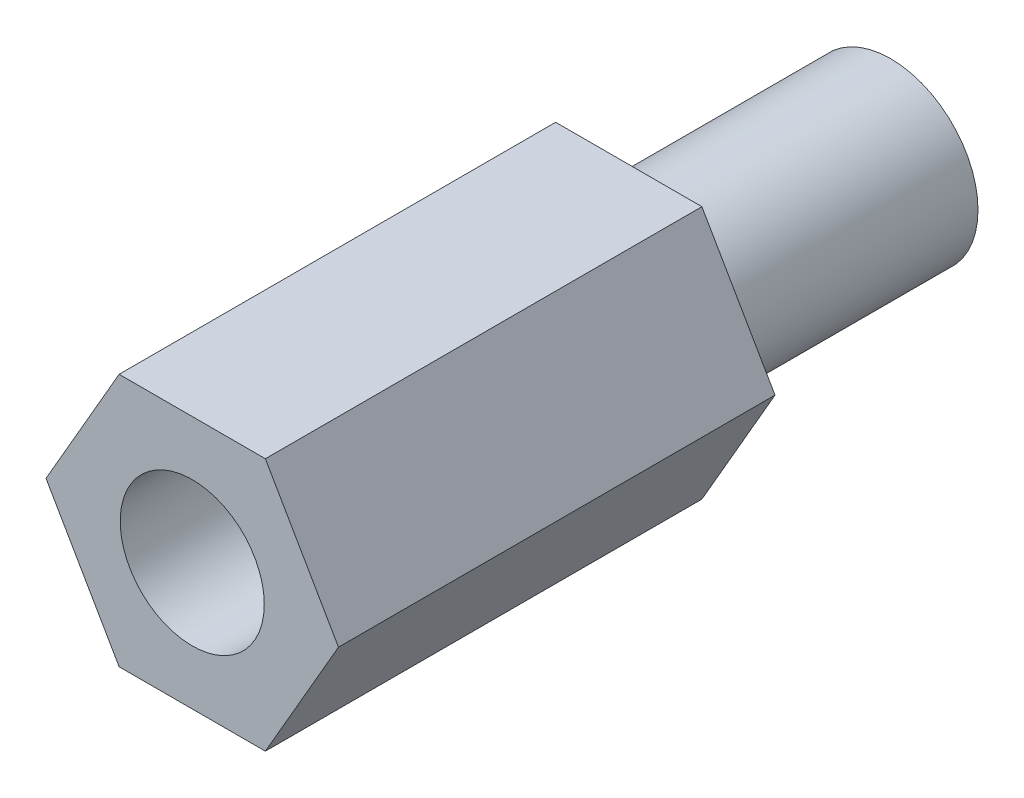
ISO-10303-21;
HEADER;
FILE_DESCRIPTION(('STEP AP214'),'2;1');
FILE_NAME('part.step','',(''),(''),'','','');
FILE_SCHEMA(('AUTOMOTIVE_DESIGN { 1 0 10303 214 1 1 1 1 }'));
ENDSEC;
DATA;
#1=APPLICATION_CONTEXT('core data for automotive mechanical design processes');
#2=APPLICATION_PROTOCOL_DEFINITION('international standard','automotive_design',2000,#1);
#3=PRODUCT_CONTEXT('',#1,'mechanical');
#4=PRODUCT('Part','Part','',(#3));
#5=PRODUCT_RELATED_PRODUCT_CATEGORY('part','',(#4));
#6=PRODUCT_DEFINITION_FORMATION('','',#4);
#7=PRODUCT_DEFINITION_CONTEXT('part definition',#1,'design');
#8=PRODUCT_DEFINITION('design','',#6,#7);
#9=PRODUCT_DEFINITION_SHAPE('','',#8);
#10=(LENGTH_UNIT() NAMED_UNIT(*) SI_UNIT(.MILLI.,.METRE.));
#11=(NAMED_UNIT(*) PLANE_ANGLE_UNIT() SI_UNIT($,.RADIAN.));
#12=(NAMED_UNIT(*) SI_UNIT($,.STERADIAN.) SOLID_ANGLE_UNIT());
#13=UNCERTAINTY_MEASURE_WITH_UNIT(LENGTH_MEASURE(1.E-05),#10,'distance_accuracy_value','');
#14=(GEOMETRIC_REPRESENTATION_CONTEXT(3) GLOBAL_UNCERTAINTY_ASSIGNED_CONTEXT((#13)) GLOBAL_UNIT_ASSIGNED_CONTEXT((#10,
#11,#12)) REPRESENTATION_CONTEXT('',''));
#15=CARTESIAN_POINT('',(0.,0.,0.));
#16=DIRECTION('',(0.,0.,1.));
#17=DIRECTION('',(1.,0.,0.));
#18=AXIS2_PLACEMENT_3D('',#15,#16,#17);
#19=CARTESIAN_POINT('',(3.35,0.,10.));
#20=DIRECTION('',(-0.866025403784438,-0.5,0.));
#21=DIRECTION('',(0.5,-0.866025403784439,0.));
#22=AXIS2_PLACEMENT_3D('',#19,#20,#21);
#23=PLANE('',#22);
#24=DIRECTION('',(-0.5,0.866025403784438,0.));
#25=VECTOR('',#24,1.);
#26=CARTESIAN_POINT('',(3.35,0.,0.));
#27=LINE('',#26,#25);
#28=CARTESIAN_POINT('',(3.35,0.,0.));
#29=VERTEX_POINT('',#28);
#30=CARTESIAN_POINT('',(1.675,2.90118510267787,0.));
#31=VERTEX_POINT('',#30);
#32=EDGE_CURVE('E121',#29,#31,#27,.T.);
#33=ORIENTED_EDGE('',*,*,#32,.T.);
#34=DIRECTION('',(0.,0.,-1.));
#35=VECTOR('',#34,1.);
#36=CARTESIAN_POINT('',(1.675,2.90118510267787,10.));
#37=LINE('',#36,#35);
#38=CARTESIAN_POINT('',(1.675,2.90118510267787,10.));
#39=VERTEX_POINT('',#38);
#40=EDGE_CURVE('E38',#39,#31,#37,.T.);
#41=ORIENTED_EDGE('',*,*,#40,.F.);
#42=DIRECTION('',(-0.5,0.866025403784438,0.));
#43=VECTOR('',#42,1.);
#44=CARTESIAN_POINT('',(3.35,0.,10.));
#45=LINE('',#44,#43);
#46=CARTESIAN_POINT('',(3.35,0.,10.));
#47=VERTEX_POINT('',#46);
#48=EDGE_CURVE('E132',#47,#39,#45,.T.);
#49=ORIENTED_EDGE('',*,*,#48,.F.);
#50=DIRECTION('',(0.,0.,-1.));
#51=VECTOR('',#50,1.);
#52=CARTESIAN_POINT('',(3.35,0.,10.));
#53=LINE('',#52,#51);
#54=EDGE_CURVE('E117',#47,#29,#53,.T.);
#55=ORIENTED_EDGE('',*,*,#54,.T.);
#56=EDGE_LOOP('',(#33,#41,#49,#55));
#57=FACE_BOUND('',#56,.T.);
#58=ADVANCED_FACE('F35',(#57),#23,.F.);
#59=CARTESIAN_POINT('',(1.675,2.90118510267787,10.));
#60=DIRECTION('',(0.,-1.,0.));
#61=DIRECTION('',(1.,0.,0.));
#62=AXIS2_PLACEMENT_3D('',#59,#60,#61);
#63=PLANE('',#62);
#64=DIRECTION('',(-1.,0.,0.));
#65=VECTOR('',#64,1.);
#66=CARTESIAN_POINT('',(1.675,2.90118510267787,0.));
#67=LINE('',#66,#65);
#68=CARTESIAN_POINT('',(-1.675,2.90118510267787,0.));
#69=VERTEX_POINT('',#68);
#70=EDGE_CURVE('E124',#31,#69,#67,.T.);
#71=ORIENTED_EDGE('',*,*,#70,.T.);
#72=DIRECTION('',(0.,0.,-1.));
#73=VECTOR('',#72,1.);
#74=CARTESIAN_POINT('',(-1.675,2.90118510267787,10.));
#75=LINE('',#74,#73);
#76=CARTESIAN_POINT('',(-1.675,2.90118510267787,10.));
#77=VERTEX_POINT('',#76);
#78=EDGE_CURVE('E135',#77,#69,#75,.T.);
#79=ORIENTED_EDGE('',*,*,#78,.F.);
#80=DIRECTION('',(-1.,0.,0.));
#81=VECTOR('',#80,1.);
#82=CARTESIAN_POINT('',(1.675,2.90118510267787,10.));
#83=LINE('',#82,#81);
#84=EDGE_CURVE('E90',#39,#77,#83,.T.);
#85=ORIENTED_EDGE('',*,*,#84,.F.);
#86=ORIENTED_EDGE('',*,*,#40,.T.);
#87=EDGE_LOOP('',(#71,#79,#85,#86));
#88=FACE_BOUND('',#87,.T.);
#89=ADVANCED_FACE('F140',(#88),#63,.F.);
#90=CARTESIAN_POINT('',(-1.675,2.90118510267787,10.));
#91=DIRECTION('',(0.866025403784439,-0.5,0.));
#92=DIRECTION('',(0.5,0.866025403784439,0.));
#93=AXIS2_PLACEMENT_3D('',#90,#91,#92);
#94=PLANE('',#93);
#95=DIRECTION('',(-0.5,-0.866025403784439,0.));
#96=VECTOR('',#95,1.);
#97=CARTESIAN_POINT('',(-1.675,2.90118510267787,0.));
#98=LINE('',#97,#96);
#99=CARTESIAN_POINT('',(-3.35,0.,0.));
#100=VERTEX_POINT('',#99);
#101=EDGE_CURVE('E127',#69,#100,#98,.T.);
#102=ORIENTED_EDGE('',*,*,#101,.T.);
#103=DIRECTION('',(0.,0.,-1.));
#104=VECTOR('',#103,1.);
#105=CARTESIAN_POINT('',(-3.35,0.,10.));
#106=LINE('',#105,#104);
#107=CARTESIAN_POINT('',(-3.35,0.,10.));
#108=VERTEX_POINT('',#107);
#109=EDGE_CURVE('E112',#108,#100,#106,.T.);
#110=ORIENTED_EDGE('',*,*,#109,.F.);
#111=DIRECTION('',(-0.5,-0.866025403784439,0.));
#112=VECTOR('',#111,1.);
#113=CARTESIAN_POINT('',(-1.675,2.90118510267787,10.));
#114=LINE('',#113,#112);
#115=EDGE_CURVE('E103',#77,#108,#114,.T.);
#116=ORIENTED_EDGE('',*,*,#115,.F.);
#117=ORIENTED_EDGE('',*,*,#78,.T.);
#118=EDGE_LOOP('',(#102,#110,#116,#117));
#119=FACE_BOUND('',#118,.T.);
#120=ADVANCED_FACE('F146',(#119),#94,.F.);
#121=CARTESIAN_POINT('',(-3.35,0.,10.));
#122=DIRECTION('',(0.866025403784438,0.5,0.));
#123=DIRECTION('',(-0.5,0.866025403784438,0.));
#124=AXIS2_PLACEMENT_3D('',#121,#122,#123);
#125=PLANE('',#124);
#126=DIRECTION('',(0.5,-0.866025403784438,0.));
#127=VECTOR('',#126,1.);
#128=CARTESIAN_POINT('',(-3.35,0.,0.));
#129=LINE('',#128,#127);
#130=CARTESIAN_POINT('',(-1.675,-2.90118510267787,0.));
#131=VERTEX_POINT('',#130);
#132=EDGE_CURVE('E111',#100,#131,#129,.T.);
#133=ORIENTED_EDGE('',*,*,#132,.T.);
#134=DIRECTION('',(0.,0.,-1.));
#135=VECTOR('',#134,1.);
#136=CARTESIAN_POINT('',(-1.675,-2.90118510267787,10.));
#137=LINE('',#136,#135);
#138=CARTESIAN_POINT('',(-1.675,-2.90118510267787,10.));
#139=VERTEX_POINT('',#138);
#140=EDGE_CURVE('E108',#139,#131,#137,.T.);
#141=ORIENTED_EDGE('',*,*,#140,.F.);
#142=DIRECTION('',(0.5,-0.866025403784438,0.));
#143=VECTOR('',#142,1.);
#144=CARTESIAN_POINT('',(-3.35,0.,10.));
#145=LINE('',#144,#143);
#146=EDGE_CURVE('E97',#108,#139,#145,.T.);
#147=ORIENTED_EDGE('',*,*,#146,.F.);
#148=ORIENTED_EDGE('',*,*,#109,.T.);
#149=EDGE_LOOP('',(#133,#141,#147,#148));
#150=FACE_BOUND('',#149,.T.);
#151=ADVANCED_FACE('F109',(#150),#125,.F.);
#152=CARTESIAN_POINT('',(-1.675,-2.90118510267787,10.));
#153=DIRECTION('',(0.,1.,0.));
#154=DIRECTION('',(-1.,0.,0.));
#155=AXIS2_PLACEMENT_3D('',#152,#153,#154);
#156=PLANE('',#155);
#157=DIRECTION('',(1.,0.,0.));
#158=VECTOR('',#157,1.);
#159=CARTESIAN_POINT('',(-1.675,-2.90118510267787,0.));
#160=LINE('',#159,#158);
#161=CARTESIAN_POINT('',(1.675,-2.90118510267787,0.));
#162=VERTEX_POINT('',#161);
#163=EDGE_CURVE('E75',#131,#162,#160,.T.);
#164=ORIENTED_EDGE('',*,*,#163,.T.);
#165=DIRECTION('',(0.,0.,-1.));
#166=VECTOR('',#165,1.);
#167=CARTESIAN_POINT('',(1.675,-2.90118510267787,10.));
#168=LINE('',#167,#166);
#169=CARTESIAN_POINT('',(1.675,-2.90118510267787,10.));
#170=VERTEX_POINT('',#169);
#171=EDGE_CURVE('E113',#170,#162,#168,.T.);
#172=ORIENTED_EDGE('',*,*,#171,.F.);
#173=DIRECTION('',(1.,0.,0.));
#174=VECTOR('',#173,1.);
#175=CARTESIAN_POINT('',(-1.675,-2.90118510267787,10.));
#176=LINE('',#175,#174);
#177=EDGE_CURVE('E101',#139,#170,#176,.T.);
#178=ORIENTED_EDGE('',*,*,#177,.F.);
#179=ORIENTED_EDGE('',*,*,#140,.T.);
#180=EDGE_LOOP('',(#164,#172,#178,#179));
#181=FACE_BOUND('',#180,.T.);
#182=ADVANCED_FACE('F115',(#181),#156,.F.);
#183=CARTESIAN_POINT('',(1.675,-2.90118510267787,10.));
#184=DIRECTION('',(-0.866025403784439,0.5,0.));
#185=DIRECTION('',(-0.5,-0.866025403784439,0.));
#186=AXIS2_PLACEMENT_3D('',#183,#184,#185);
#187=PLANE('',#186);
#188=DIRECTION('',(0.5,0.866025403784439,0.));
#189=VECTOR('',#188,1.);
#190=CARTESIAN_POINT('',(1.675,-2.90118510267787,0.));
#191=LINE('',#190,#189);
#192=EDGE_CURVE('E81',#162,#29,#191,.T.);
#193=ORIENTED_EDGE('',*,*,#192,.T.);
#194=ORIENTED_EDGE('',*,*,#54,.F.);
#195=DIRECTION('',(0.5,0.866025403784439,0.));
#196=VECTOR('',#195,1.);
#197=CARTESIAN_POINT('',(1.675,-2.90118510267787,10.));
#198=LINE('',#197,#196);
#199=EDGE_CURVE('E52',#170,#47,#198,.T.);
#200=ORIENTED_EDGE('',*,*,#199,.F.);
#201=ORIENTED_EDGE('',*,*,#171,.T.);
#202=EDGE_LOOP('',(#193,#194,#200,#201));
#203=FACE_BOUND('',#202,.T.);
#204=ADVANCED_FACE('F169',(#203),#187,.F.);
#205=CARTESIAN_POINT('',(0.,0.,10.));
#206=DIRECTION('',(0.,0.,1.));
#207=DIRECTION('',(1.,0.,0.));
#208=AXIS2_PLACEMENT_3D('',#205,#206,#207);
#209=PLANE('',#208);
#210=CARTESIAN_POINT('',(0.,0.,10.));
#211=DIRECTION('',(0.,0.,1.));
#212=DIRECTION('',(1.,0.,0.));
#213=AXIS2_PLACEMENT_3D('',#210,#211,#212);
#214=CIRCLE('',#213,1.65);
#215=CARTESIAN_POINT('',(1.65,0.,10.));
#216=VERTEX_POINT('',#215);
#217=EDGE_CURVE('E153',#216,#216,#214,.T.);
#218=ORIENTED_EDGE('',*,*,#217,.F.);
#219=EDGE_LOOP('',(#218));
#220=FACE_BOUND('',#219,.T.);
#221=ORIENTED_EDGE('',*,*,#48,.T.);
#222=ORIENTED_EDGE('',*,*,#84,.T.);
#223=ORIENTED_EDGE('',*,*,#115,.T.);
#224=ORIENTED_EDGE('',*,*,#146,.T.);
#225=ORIENTED_EDGE('',*,*,#177,.T.);
#226=ORIENTED_EDGE('',*,*,#199,.T.);
#227=EDGE_LOOP('',(#221,#222,#223,#224,#225,#226));
#228=FACE_BOUND('',#227,.T.);
#229=ADVANCED_FACE('F99',(#220,#228),#209,.T.);
#230=CARTESIAN_POINT('',(0.,0.,0.));
#231=DIRECTION('',(0.,0.,1.));
#232=DIRECTION('',(1.,0.,0.));
#233=AXIS2_PLACEMENT_3D('',#230,#231,#232);
#234=PLANE('',#233);
#235=CARTESIAN_POINT('',(0.,0.,0.));
#236=DIRECTION('',(0.,0.,-1.));
#237=DIRECTION('',(-1.,0.,0.));
#238=AXIS2_PLACEMENT_3D('',#235,#236,#237);
#239=CIRCLE('',#238,2.);
#240=CARTESIAN_POINT('',(-2.,0.,0.));
#241=VERTEX_POINT('',#240);
#242=EDGE_CURVE('E11',#241,#241,#239,.T.);
#243=ORIENTED_EDGE('',*,*,#242,.F.);
#244=EDGE_LOOP('',(#243));
#245=FACE_BOUND('',#244,.T.);
#246=ORIENTED_EDGE('',*,*,#32,.F.);
#247=ORIENTED_EDGE('',*,*,#192,.F.);
#248=ORIENTED_EDGE('',*,*,#163,.F.);
#249=ORIENTED_EDGE('',*,*,#132,.F.);
#250=ORIENTED_EDGE('',*,*,#101,.F.);
#251=ORIENTED_EDGE('',*,*,#70,.F.);
#252=EDGE_LOOP('',(#246,#247,#248,#249,#250,#251));
#253=FACE_BOUND('',#252,.T.);
#254=ADVANCED_FACE('F145',(#245,#253),#234,.F.);
#255=CARTESIAN_POINT('',(0.,0.,-6.));
#256=DIRECTION('',(0.,0.,1.));
#257=DIRECTION('',(1.,0.,0.));
#258=AXIS2_PLACEMENT_3D('',#255,#256,#257);
#259=CYLINDRICAL_SURFACE('',#258,2.);
#260=CARTESIAN_POINT('',(0.,0.,-6.));
#261=DIRECTION('',(0.,0.,-1.));
#262=DIRECTION('',(-1.,0.,0.));
#263=AXIS2_PLACEMENT_3D('',#260,#261,#262);
#264=CIRCLE('',#263,2.);
#265=CARTESIAN_POINT('',(-2.,0.,-6.));
#266=VERTEX_POINT('',#265);
#267=EDGE_CURVE('E125',#266,#266,#264,.T.);
#268=ORIENTED_EDGE('',*,*,#267,.F.);
#269=EDGE_LOOP('',(#268));
#270=FACE_BOUND('',#269,.T.);
#271=ORIENTED_EDGE('',*,*,#242,.T.);
#272=EDGE_LOOP('',(#271));
#273=FACE_BOUND('',#272,.T.);
#274=ADVANCED_FACE('F175',(#270,#273),#259,.T.);
#275=CARTESIAN_POINT('',(0.,0.,-6.));
#276=DIRECTION('',(0.,0.,-1.));
#277=DIRECTION('',(-1.,0.,0.));
#278=AXIS2_PLACEMENT_3D('',#275,#276,#277);
#279=PLANE('',#278);
#280=ORIENTED_EDGE('',*,*,#267,.T.);
#281=EDGE_LOOP('',(#280));
#282=FACE_BOUND('',#281,.T.);
#283=ADVANCED_FACE('F164',(#282),#279,.T.);
#284=CARTESIAN_POINT('',(0.,0.,5.));
#285=DIRECTION('',(0.,0.,1.));
#286=DIRECTION('',(1.,0.,0.));
#287=AXIS2_PLACEMENT_3D('',#284,#285,#286);
#288=CYLINDRICAL_SURFACE('',#287,1.65);
#289=CARTESIAN_POINT('',(0.,0.,5.));
#290=DIRECTION('',(0.,0.,1.));
#291=DIRECTION('',(1.,0.,0.));
#292=AXIS2_PLACEMENT_3D('',#289,#290,#291);
#293=CIRCLE('',#292,1.65);
#294=CARTESIAN_POINT('',(1.65,0.,5.));
#295=VERTEX_POINT('',#294);
#296=EDGE_CURVE('E152',#295,#295,#293,.T.);
#297=ORIENTED_EDGE('',*,*,#296,.F.);
#298=EDGE_LOOP('',(#297));
#299=FACE_BOUND('',#298,.T.);
#300=ORIENTED_EDGE('',*,*,#217,.T.);
#301=EDGE_LOOP('',(#300));
#302=FACE_BOUND('',#301,.T.);
#303=ADVANCED_FACE('F161',(#299,#302),#288,.F.);
#304=CARTESIAN_POINT('',(0.,0.,5.));
#305=DIRECTION('',(0.,0.,1.));
#306=DIRECTION('',(1.,0.,0.));
#307=AXIS2_PLACEMENT_3D('',#304,#305,#306);
#308=PLANE('',#307);
#309=ORIENTED_EDGE('',*,*,#296,.T.);
#310=EDGE_LOOP('',(#309));
#311=FACE_BOUND('',#310,.T.);
#312=ADVANCED_FACE('F159',(#311),#308,.T.);
#313=CLOSED_SHELL('',(#58,#89,#120,#151,#182,#204,#229,#254,#274,#283,#303,#312));
#314=MANIFOLD_SOLID_BREP('B2',#313);
#315=ADVANCED_BREP_SHAPE_REPRESENTATION('',(#18,#314),#14);
#316=SHAPE_DEFINITION_REPRESENTATION(#9,#315);
ENDSEC;
END-ISO-10303-21;
